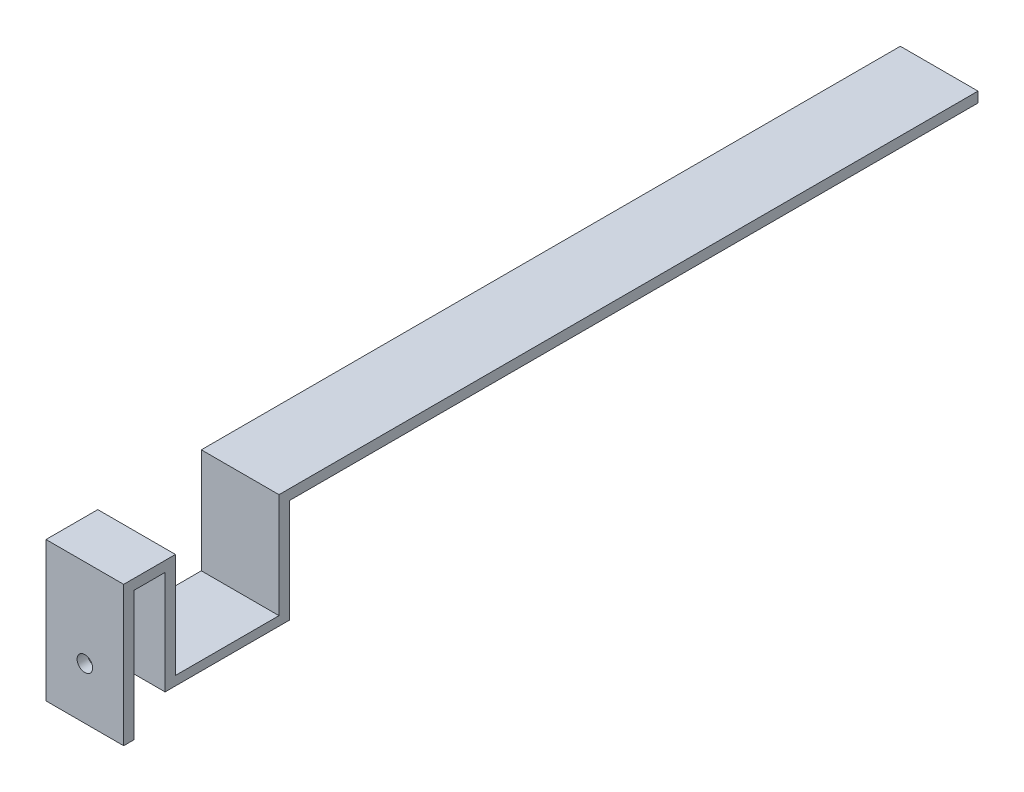
ISO-10303-21;
HEADER;
FILE_DESCRIPTION(('STEP AP214'),'2;1');
FILE_NAME('part.step','',(''),(''),'','','');
FILE_SCHEMA(('AUTOMOTIVE_DESIGN { 1 0 10303 214 1 1 1 1 }'));
ENDSEC;
DATA;
#1=APPLICATION_CONTEXT('core data for automotive mechanical design processes');
#2=APPLICATION_PROTOCOL_DEFINITION('international standard','automotive_design',2000,#1);
#3=PRODUCT_CONTEXT('',#1,'mechanical');
#4=PRODUCT('Part','Part','',(#3));
#5=PRODUCT_RELATED_PRODUCT_CATEGORY('part','',(#4));
#6=PRODUCT_DEFINITION_FORMATION('','',#4);
#7=PRODUCT_DEFINITION_CONTEXT('part definition',#1,'design');
#8=PRODUCT_DEFINITION('design','',#6,#7);
#9=PRODUCT_DEFINITION_SHAPE('','',#8);
#10=(LENGTH_UNIT() NAMED_UNIT(*) SI_UNIT(.MILLI.,.METRE.));
#11=(NAMED_UNIT(*) PLANE_ANGLE_UNIT() SI_UNIT($,.RADIAN.));
#12=(NAMED_UNIT(*) SI_UNIT($,.STERADIAN.) SOLID_ANGLE_UNIT());
#13=UNCERTAINTY_MEASURE_WITH_UNIT(LENGTH_MEASURE(1.E-05),#10,'distance_accuracy_value','');
#14=(GEOMETRIC_REPRESENTATION_CONTEXT(3) GLOBAL_UNCERTAINTY_ASSIGNED_CONTEXT((#13)) GLOBAL_UNIT_ASSIGNED_CONTEXT((#10,
#11,#12)) REPRESENTATION_CONTEXT('',''));
#15=CARTESIAN_POINT('',(0.,0.,0.));
#16=DIRECTION('',(0.,0.,1.));
#17=DIRECTION('',(1.,0.,0.));
#18=AXIS2_PLACEMENT_3D('',#15,#16,#17);
#19=CARTESIAN_POINT('',(15.,0.,0.));
#20=DIRECTION('',(0.,0.,-1.));
#21=DIRECTION('',(0.,1.,0.));
#22=AXIS2_PLACEMENT_3D('',#19,#20,#21);
#23=PLANE('',#22);
#24=CARTESIAN_POINT('',(7.5,10.,0.));
#25=DIRECTION('',(0.,0.,1.));
#26=DIRECTION('',(1.,0.,0.));
#27=AXIS2_PLACEMENT_3D('',#24,#25,#26);
#28=CIRCLE('',#27,1.5);
#29=CARTESIAN_POINT('',(9.,10.,0.));
#30=VERTEX_POINT('',#29);
#31=EDGE_CURVE('E287',#30,#30,#28,.T.);
#32=ORIENTED_EDGE('',*,*,#31,.F.);
#33=EDGE_LOOP('',(#32));
#34=FACE_BOUND('',#33,.T.);
#35=DIRECTION('',(0.,-1.,0.));
#36=VECTOR('',#35,1.);
#37=CARTESIAN_POINT('',(0.,0.,0.));
#38=LINE('',#37,#36);
#39=CARTESIAN_POINT('',(0.,27.,0.));
#40=VERTEX_POINT('',#39);
#41=CARTESIAN_POINT('',(0.,0.,0.));
#42=VERTEX_POINT('',#41);
#43=EDGE_CURVE('E165',#40,#42,#38,.T.);
#44=ORIENTED_EDGE('',*,*,#43,.T.);
#45=DIRECTION('',(-1.,0.,0.));
#46=VECTOR('',#45,1.);
#47=CARTESIAN_POINT('',(15.,0.,0.));
#48=LINE('',#47,#46);
#49=CARTESIAN_POINT('',(15.,0.,0.));
#50=VERTEX_POINT('',#49);
#51=EDGE_CURVE('E11',#50,#42,#48,.T.);
#52=ORIENTED_EDGE('',*,*,#51,.F.);
#53=DIRECTION('',(0.,-1.,0.));
#54=VECTOR('',#53,1.);
#55=CARTESIAN_POINT('',(15.,0.,0.));
#56=LINE('',#55,#54);
#57=CARTESIAN_POINT('',(15.,27.,0.));
#58=VERTEX_POINT('',#57);
#59=EDGE_CURVE('E192',#58,#50,#56,.T.);
#60=ORIENTED_EDGE('',*,*,#59,.F.);
#61=DIRECTION('',(-1.,0.,0.));
#62=VECTOR('',#61,1.);
#63=CARTESIAN_POINT('',(15.,27.,0.));
#64=LINE('',#63,#62);
#65=EDGE_CURVE('E161',#58,#40,#64,.T.);
#66=ORIENTED_EDGE('',*,*,#65,.T.);
#67=EDGE_LOOP('',(#44,#52,#60,#66));
#68=FACE_BOUND('',#67,.T.);
#69=ADVANCED_FACE('F33',(#34,#68),#23,.F.);
#70=CARTESIAN_POINT('',(15.,0.,0.));
#71=DIRECTION('',(0.,1.,0.));
#72=DIRECTION('',(0.,0.,1.));
#73=AXIS2_PLACEMENT_3D('',#70,#71,#72);
#74=PLANE('',#73);
#75=DIRECTION('',(0.,0.,-1.));
#76=VECTOR('',#75,1.);
#77=CARTESIAN_POINT('',(0.,0.,0.));
#78=LINE('',#77,#76);
#79=CARTESIAN_POINT('',(0.,0.,-2.));
#80=VERTEX_POINT('',#79);
#81=EDGE_CURVE('E168',#42,#80,#78,.T.);
#82=ORIENTED_EDGE('',*,*,#81,.T.);
#83=DIRECTION('',(-1.,0.,0.));
#84=VECTOR('',#83,1.);
#85=CARTESIAN_POINT('',(15.,0.,-2.));
#86=LINE('',#85,#84);
#87=CARTESIAN_POINT('',(15.,0.,-2.));
#88=VERTEX_POINT('',#87);
#89=EDGE_CURVE('E41',#88,#80,#86,.T.);
#90=ORIENTED_EDGE('',*,*,#89,.F.);
#91=DIRECTION('',(0.,0.,-1.));
#92=VECTOR('',#91,1.);
#93=CARTESIAN_POINT('',(15.,0.,0.));
#94=LINE('',#93,#92);
#95=EDGE_CURVE('E110',#50,#88,#94,.T.);
#96=ORIENTED_EDGE('',*,*,#95,.F.);
#97=ORIENTED_EDGE('',*,*,#51,.T.);
#98=EDGE_LOOP('',(#82,#90,#96,#97));
#99=FACE_BOUND('',#98,.T.);
#100=ADVANCED_FACE('F280',(#99),#74,.F.);
#101=CARTESIAN_POINT('',(15.,0.,-2.));
#102=DIRECTION('',(0.,0.,1.));
#103=DIRECTION('',(1.,0.,0.));
#104=AXIS2_PLACEMENT_3D('',#101,#102,#103);
#105=PLANE('',#104);
#106=CARTESIAN_POINT('',(7.5,10.,-2.));
#107=DIRECTION('',(0.,0.,1.));
#108=DIRECTION('',(1.,0.,0.));
#109=AXIS2_PLACEMENT_3D('',#106,#107,#108);
#110=CIRCLE('',#109,1.5);
#111=CARTESIAN_POINT('',(9.,10.,-2.));
#112=VERTEX_POINT('',#111);
#113=EDGE_CURVE('E169',#112,#112,#110,.T.);
#114=ORIENTED_EDGE('',*,*,#113,.T.);
#115=EDGE_LOOP('',(#114));
#116=FACE_BOUND('',#115,.T.);
#117=DIRECTION('',(0.,1.,0.));
#118=VECTOR('',#117,1.);
#119=CARTESIAN_POINT('',(0.,0.,-2.));
#120=LINE('',#119,#118);
#121=CARTESIAN_POINT('',(0.,25.,-2.));
#122=VERTEX_POINT('',#121);
#123=EDGE_CURVE('E171',#80,#122,#120,.T.);
#124=ORIENTED_EDGE('',*,*,#123,.T.);
#125=DIRECTION('',(-1.,0.,0.));
#126=VECTOR('',#125,1.);
#127=CARTESIAN_POINT('',(15.,25.,-2.));
#128=LINE('',#127,#126);
#129=CARTESIAN_POINT('',(15.,25.,-2.));
#130=VERTEX_POINT('',#129);
#131=EDGE_CURVE('E217',#130,#122,#128,.T.);
#132=ORIENTED_EDGE('',*,*,#131,.F.);
#133=DIRECTION('',(0.,1.,0.));
#134=VECTOR('',#133,1.);
#135=CARTESIAN_POINT('',(15.,0.,-2.));
#136=LINE('',#135,#134);
#137=EDGE_CURVE('E225',#88,#130,#136,.T.);
#138=ORIENTED_EDGE('',*,*,#137,.F.);
#139=ORIENTED_EDGE('',*,*,#89,.T.);
#140=EDGE_LOOP('',(#124,#132,#138,#139));
#141=FACE_BOUND('',#140,.T.);
#142=ADVANCED_FACE('F223',(#116,#141),#105,.F.);
#143=CARTESIAN_POINT('',(15.,25.,-2.));
#144=DIRECTION('',(0.,1.,0.));
#145=DIRECTION('',(0.,0.,1.));
#146=AXIS2_PLACEMENT_3D('',#143,#144,#145);
#147=PLANE('',#146);
#148=DIRECTION('',(0.,0.,-1.));
#149=VECTOR('',#148,1.);
#150=CARTESIAN_POINT('',(0.,25.,-2.));
#151=LINE('',#150,#149);
#152=CARTESIAN_POINT('',(0.,25.,-8.));
#153=VERTEX_POINT('',#152);
#154=EDGE_CURVE('E173',#122,#153,#151,.T.);
#155=ORIENTED_EDGE('',*,*,#154,.T.);
#156=DIRECTION('',(-1.,0.,0.));
#157=VECTOR('',#156,1.);
#158=CARTESIAN_POINT('',(15.,25.,-8.));
#159=LINE('',#158,#157);
#160=CARTESIAN_POINT('',(15.,25.,-8.));
#161=VERTEX_POINT('',#160);
#162=EDGE_CURVE('E214',#161,#153,#159,.T.);
#163=ORIENTED_EDGE('',*,*,#162,.F.);
#164=DIRECTION('',(0.,0.,-1.));
#165=VECTOR('',#164,1.);
#166=CARTESIAN_POINT('',(15.,25.,-2.));
#167=LINE('',#166,#165);
#168=EDGE_CURVE('E243',#130,#161,#167,.T.);
#169=ORIENTED_EDGE('',*,*,#168,.F.);
#170=ORIENTED_EDGE('',*,*,#131,.T.);
#171=EDGE_LOOP('',(#155,#163,#169,#170));
#172=FACE_BOUND('',#171,.T.);
#173=ADVANCED_FACE('F234',(#172),#147,.F.);
#174=CARTESIAN_POINT('',(15.,25.,-8.));
#175=DIRECTION('',(0.,0.,-1.));
#176=DIRECTION('',(-1.,0.,0.));
#177=AXIS2_PLACEMENT_3D('',#174,#175,#176);
#178=PLANE('',#177);
#179=DIRECTION('',(0.,-1.,0.));
#180=VECTOR('',#179,1.);
#181=CARTESIAN_POINT('',(0.,25.,-8.));
#182=LINE('',#181,#180);
#183=CARTESIAN_POINT('',(0.,5.,-8.));
#184=VERTEX_POINT('',#183);
#185=EDGE_CURVE('E175',#153,#184,#182,.T.);
#186=ORIENTED_EDGE('',*,*,#185,.T.);
#187=DIRECTION('',(-1.,0.,0.));
#188=VECTOR('',#187,1.);
#189=CARTESIAN_POINT('',(15.,5.,-8.));
#190=LINE('',#189,#188);
#191=CARTESIAN_POINT('',(15.,5.,-8.));
#192=VERTEX_POINT('',#191);
#193=EDGE_CURVE('E211',#192,#184,#190,.T.);
#194=ORIENTED_EDGE('',*,*,#193,.F.);
#195=DIRECTION('',(0.,-1.,0.));
#196=VECTOR('',#195,1.);
#197=CARTESIAN_POINT('',(15.,25.,-8.));
#198=LINE('',#197,#196);
#199=EDGE_CURVE('E240',#161,#192,#198,.T.);
#200=ORIENTED_EDGE('',*,*,#199,.F.);
#201=ORIENTED_EDGE('',*,*,#162,.T.);
#202=EDGE_LOOP('',(#186,#194,#200,#201));
#203=FACE_BOUND('',#202,.T.);
#204=ADVANCED_FACE('F238',(#203),#178,.F.);
#205=CARTESIAN_POINT('',(15.,5.,-8.));
#206=DIRECTION('',(0.,1.,0.));
#207=DIRECTION('',(0.,0.,1.));
#208=AXIS2_PLACEMENT_3D('',#205,#206,#207);
#209=PLANE('',#208);
#210=DIRECTION('',(0.,0.,-1.));
#211=VECTOR('',#210,1.);
#212=CARTESIAN_POINT('',(0.,5.,-8.));
#213=LINE('',#212,#211);
#214=CARTESIAN_POINT('',(0.,5.,-32.));
#215=VERTEX_POINT('',#214);
#216=EDGE_CURVE('E177',#184,#215,#213,.T.);
#217=ORIENTED_EDGE('',*,*,#216,.T.);
#218=DIRECTION('',(-1.,0.,0.));
#219=VECTOR('',#218,1.);
#220=CARTESIAN_POINT('',(15.,5.,-32.));
#221=LINE('',#220,#219);
#222=CARTESIAN_POINT('',(15.,5.,-32.));
#223=VERTEX_POINT('',#222);
#224=EDGE_CURVE('E208',#223,#215,#221,.T.);
#225=ORIENTED_EDGE('',*,*,#224,.F.);
#226=DIRECTION('',(0.,0.,-1.));
#227=VECTOR('',#226,1.);
#228=CARTESIAN_POINT('',(15.,5.,-8.));
#229=LINE('',#228,#227);
#230=EDGE_CURVE('E242',#192,#223,#229,.T.);
#231=ORIENTED_EDGE('',*,*,#230,.F.);
#232=ORIENTED_EDGE('',*,*,#193,.T.);
#233=EDGE_LOOP('',(#217,#225,#231,#232));
#234=FACE_BOUND('',#233,.T.);
#235=ADVANCED_FACE('F373',(#234),#209,.F.);
#236=CARTESIAN_POINT('',(15.,5.,-32.));
#237=DIRECTION('',(0.,0.,1.));
#238=DIRECTION('',(1.,0.,0.));
#239=AXIS2_PLACEMENT_3D('',#236,#237,#238);
#240=PLANE('',#239);
#241=DIRECTION('',(0.,1.,0.));
#242=VECTOR('',#241,1.);
#243=CARTESIAN_POINT('',(0.,5.,-32.));
#244=LINE('',#243,#242);
#245=CARTESIAN_POINT('',(0.,25.,-32.));
#246=VERTEX_POINT('',#245);
#247=EDGE_CURVE('E179',#215,#246,#244,.T.);
#248=ORIENTED_EDGE('',*,*,#247,.T.);
#249=DIRECTION('',(-1.,0.,0.));
#250=VECTOR('',#249,1.);
#251=CARTESIAN_POINT('',(15.,25.,-32.));
#252=LINE('',#251,#250);
#253=CARTESIAN_POINT('',(15.,25.,-32.));
#254=VERTEX_POINT('',#253);
#255=EDGE_CURVE('E205',#254,#246,#252,.T.);
#256=ORIENTED_EDGE('',*,*,#255,.F.);
#257=DIRECTION('',(0.,1.,0.));
#258=VECTOR('',#257,1.);
#259=CARTESIAN_POINT('',(15.,5.,-32.));
#260=LINE('',#259,#258);
#261=EDGE_CURVE('E245',#223,#254,#260,.T.);
#262=ORIENTED_EDGE('',*,*,#261,.F.);
#263=ORIENTED_EDGE('',*,*,#224,.T.);
#264=EDGE_LOOP('',(#248,#256,#262,#263));
#265=FACE_BOUND('',#264,.T.);
#266=ADVANCED_FACE('F363',(#265),#240,.F.);
#267=CARTESIAN_POINT('',(15.,25.,-32.));
#268=DIRECTION('',(0.,1.,0.));
#269=DIRECTION('',(0.,0.,1.));
#270=AXIS2_PLACEMENT_3D('',#267,#268,#269);
#271=PLANE('',#270);
#272=DIRECTION('',(0.,0.,-1.));
#273=VECTOR('',#272,1.);
#274=CARTESIAN_POINT('',(0.,25.,-32.));
#275=LINE('',#274,#273);
#276=CARTESIAN_POINT('',(0.,25.,-165.));
#277=VERTEX_POINT('',#276);
#278=EDGE_CURVE('E181',#246,#277,#275,.T.);
#279=ORIENTED_EDGE('',*,*,#278,.T.);
#280=DIRECTION('',(-1.,0.,0.));
#281=VECTOR('',#280,1.);
#282=CARTESIAN_POINT('',(15.,25.,-165.));
#283=LINE('',#282,#281);
#284=CARTESIAN_POINT('',(15.,25.,-165.));
#285=VERTEX_POINT('',#284);
#286=EDGE_CURVE('E202',#285,#277,#283,.T.);
#287=ORIENTED_EDGE('',*,*,#286,.F.);
#288=DIRECTION('',(0.,0.,-1.));
#289=VECTOR('',#288,1.);
#290=CARTESIAN_POINT('',(15.,25.,-32.));
#291=LINE('',#290,#289);
#292=EDGE_CURVE('E251',#254,#285,#291,.T.);
#293=ORIENTED_EDGE('',*,*,#292,.F.);
#294=ORIENTED_EDGE('',*,*,#255,.T.);
#295=EDGE_LOOP('',(#279,#287,#293,#294));
#296=FACE_BOUND('',#295,.T.);
#297=ADVANCED_FACE('F353',(#296),#271,.F.);
#298=CARTESIAN_POINT('',(15.,27.,-165.));
#299=DIRECTION('',(0.,0.,1.));
#300=DIRECTION('',(1.,0.,0.));
#301=AXIS2_PLACEMENT_3D('',#298,#299,#300);
#302=PLANE('',#301);
#303=DIRECTION('',(0.,1.,0.));
#304=VECTOR('',#303,1.);
#305=CARTESIAN_POINT('',(0.,27.,-165.));
#306=LINE('',#305,#304);
#307=CARTESIAN_POINT('',(0.,27.,-165.));
#308=VERTEX_POINT('',#307);
#309=EDGE_CURVE('E183',#277,#308,#306,.T.);
#310=ORIENTED_EDGE('',*,*,#309,.T.);
#311=DIRECTION('',(-1.,0.,0.));
#312=VECTOR('',#311,1.);
#313=CARTESIAN_POINT('',(15.,27.,-165.));
#314=LINE('',#313,#312);
#315=CARTESIAN_POINT('',(15.,27.,-165.));
#316=VERTEX_POINT('',#315);
#317=EDGE_CURVE('E199',#316,#308,#314,.T.);
#318=ORIENTED_EDGE('',*,*,#317,.F.);
#319=DIRECTION('',(0.,1.,0.));
#320=VECTOR('',#319,1.);
#321=CARTESIAN_POINT('',(15.,27.,-165.));
#322=LINE('',#321,#320);
#323=EDGE_CURVE('E253',#285,#316,#322,.T.);
#324=ORIENTED_EDGE('',*,*,#323,.F.);
#325=ORIENTED_EDGE('',*,*,#286,.T.);
#326=EDGE_LOOP('',(#310,#318,#324,#325));
#327=FACE_BOUND('',#326,.T.);
#328=ADVANCED_FACE('F344',(#327),#302,.F.);
#329=CARTESIAN_POINT('',(15.,27.,-30.));
#330=DIRECTION('',(0.,-1.,0.));
#331=DIRECTION('',(0.,0.,-1.));
#332=AXIS2_PLACEMENT_3D('',#329,#330,#331);
#333=PLANE('',#332);
#334=DIRECTION('',(0.,0.,1.));
#335=VECTOR('',#334,1.);
#336=CARTESIAN_POINT('',(0.,27.,-30.));
#337=LINE('',#336,#335);
#338=CARTESIAN_POINT('',(0.,27.,-30.));
#339=VERTEX_POINT('',#338);
#340=EDGE_CURVE('E185',#308,#339,#337,.T.);
#341=ORIENTED_EDGE('',*,*,#340,.T.);
#342=DIRECTION('',(-1.,0.,0.));
#343=VECTOR('',#342,1.);
#344=CARTESIAN_POINT('',(15.,27.,-30.));
#345=LINE('',#344,#343);
#346=CARTESIAN_POINT('',(15.,27.,-30.));
#347=VERTEX_POINT('',#346);
#348=EDGE_CURVE('E196',#347,#339,#345,.T.);
#349=ORIENTED_EDGE('',*,*,#348,.F.);
#350=DIRECTION('',(0.,0.,1.));
#351=VECTOR('',#350,1.);
#352=CARTESIAN_POINT('',(15.,27.,-30.));
#353=LINE('',#352,#351);
#354=EDGE_CURVE('E255',#316,#347,#353,.T.);
#355=ORIENTED_EDGE('',*,*,#354,.F.);
#356=ORIENTED_EDGE('',*,*,#317,.T.);
#357=EDGE_LOOP('',(#341,#349,#355,#356));
#358=FACE_BOUND('',#357,.T.);
#359=ADVANCED_FACE('F261',(#358),#333,.F.);
#360=CARTESIAN_POINT('',(15.,6.76083305723556,-30.));
#361=DIRECTION('',(0.,0.,-1.));
#362=DIRECTION('',(-1.,0.,0.));
#363=AXIS2_PLACEMENT_3D('',#360,#361,#362);
#364=PLANE('',#363);
#365=DIRECTION('',(0.,-1.,0.));
#366=VECTOR('',#365,1.);
#367=CARTESIAN_POINT('',(0.,6.76083305723556,-30.));
#368=LINE('',#367,#366);
#369=CARTESIAN_POINT('',(0.,6.76083305723556,-30.));
#370=VERTEX_POINT('',#369);
#371=EDGE_CURVE('E187',#339,#370,#368,.T.);
#372=ORIENTED_EDGE('',*,*,#371,.T.);
#373=DIRECTION('',(-1.,0.,0.));
#374=VECTOR('',#373,1.);
#375=CARTESIAN_POINT('',(15.,6.76083305723556,-30.));
#376=LINE('',#375,#374);
#377=CARTESIAN_POINT('',(15.,6.76083305723556,-30.));
#378=VERTEX_POINT('',#377);
#379=EDGE_CURVE('E156',#378,#370,#376,.T.);
#380=ORIENTED_EDGE('',*,*,#379,.F.);
#381=DIRECTION('',(0.,-1.,0.));
#382=VECTOR('',#381,1.);
#383=CARTESIAN_POINT('',(15.,6.76083305723556,-30.));
#384=LINE('',#383,#382);
#385=EDGE_CURVE('E147',#347,#378,#384,.T.);
#386=ORIENTED_EDGE('',*,*,#385,.F.);
#387=ORIENTED_EDGE('',*,*,#348,.T.);
#388=EDGE_LOOP('',(#372,#380,#386,#387));
#389=FACE_BOUND('',#388,.T.);
#390=ADVANCED_FACE('F265',(#389),#364,.F.);
#391=CARTESIAN_POINT('',(15.,6.76083305723556,-10.));
#392=DIRECTION('',(0.,-1.,0.));
#393=DIRECTION('',(0.,0.,-1.));
#394=AXIS2_PLACEMENT_3D('',#391,#392,#393);
#395=PLANE('',#394);
#396=DIRECTION('',(0.,0.,1.));
#397=VECTOR('',#396,1.);
#398=CARTESIAN_POINT('',(0.,6.76083305723556,-10.));
#399=LINE('',#398,#397);
#400=CARTESIAN_POINT('',(0.,6.76083305723556,-10.));
#401=VERTEX_POINT('',#400);
#402=EDGE_CURVE('E155',#370,#401,#399,.T.);
#403=ORIENTED_EDGE('',*,*,#402,.T.);
#404=DIRECTION('',(-1.,0.,0.));
#405=VECTOR('',#404,1.);
#406=CARTESIAN_POINT('',(15.,6.76083305723556,-10.));
#407=LINE('',#406,#405);
#408=CARTESIAN_POINT('',(15.,6.76083305723556,-10.));
#409=VERTEX_POINT('',#408);
#410=EDGE_CURVE('E152',#409,#401,#407,.T.);
#411=ORIENTED_EDGE('',*,*,#410,.F.);
#412=DIRECTION('',(0.,0.,1.));
#413=VECTOR('',#412,1.);
#414=CARTESIAN_POINT('',(15.,6.76083305723556,-10.));
#415=LINE('',#414,#413);
#416=EDGE_CURVE('E141',#378,#409,#415,.T.);
#417=ORIENTED_EDGE('',*,*,#416,.F.);
#418=ORIENTED_EDGE('',*,*,#379,.T.);
#419=EDGE_LOOP('',(#403,#411,#417,#418));
#420=FACE_BOUND('',#419,.T.);
#421=ADVANCED_FACE('F153',(#420),#395,.F.);
#422=CARTESIAN_POINT('',(15.,27.,-10.));
#423=DIRECTION('',(0.,0.,1.));
#424=DIRECTION('',(0.,-1.,0.));
#425=AXIS2_PLACEMENT_3D('',#422,#423,#424);
#426=PLANE('',#425);
#427=DIRECTION('',(0.,1.,0.));
#428=VECTOR('',#427,1.);
#429=CARTESIAN_POINT('',(0.,27.,-10.));
#430=LINE('',#429,#428);
#431=CARTESIAN_POINT('',(0.,27.,-10.));
#432=VERTEX_POINT('',#431);
#433=EDGE_CURVE('E96',#401,#432,#430,.T.);
#434=ORIENTED_EDGE('',*,*,#433,.T.);
#435=DIRECTION('',(-1.,0.,0.));
#436=VECTOR('',#435,1.);
#437=CARTESIAN_POINT('',(15.,27.,-10.));
#438=LINE('',#437,#436);
#439=CARTESIAN_POINT('',(15.,27.,-10.));
#440=VERTEX_POINT('',#439);
#441=EDGE_CURVE('E157',#440,#432,#438,.T.);
#442=ORIENTED_EDGE('',*,*,#441,.F.);
#443=DIRECTION('',(0.,1.,0.));
#444=VECTOR('',#443,1.);
#445=CARTESIAN_POINT('',(15.,27.,-10.));
#446=LINE('',#445,#444);
#447=EDGE_CURVE('E145',#409,#440,#446,.T.);
#448=ORIENTED_EDGE('',*,*,#447,.F.);
#449=ORIENTED_EDGE('',*,*,#410,.T.);
#450=EDGE_LOOP('',(#434,#442,#448,#449));
#451=FACE_BOUND('',#450,.T.);
#452=ADVANCED_FACE('F159',(#451),#426,.F.);
#453=CARTESIAN_POINT('',(15.,27.,0.));
#454=DIRECTION('',(0.,-1.,0.));
#455=DIRECTION('',(0.,0.,-1.));
#456=AXIS2_PLACEMENT_3D('',#453,#454,#455);
#457=PLANE('',#456);
#458=DIRECTION('',(0.,0.,1.));
#459=VECTOR('',#458,1.);
#460=CARTESIAN_POINT('',(0.,27.,0.));
#461=LINE('',#460,#459);
#462=EDGE_CURVE('E102',#432,#40,#461,.T.);
#463=ORIENTED_EDGE('',*,*,#462,.T.);
#464=ORIENTED_EDGE('',*,*,#65,.F.);
#465=DIRECTION('',(0.,0.,1.));
#466=VECTOR('',#465,1.);
#467=CARTESIAN_POINT('',(15.,27.,0.));
#468=LINE('',#467,#466);
#469=EDGE_CURVE('E49',#440,#58,#468,.T.);
#470=ORIENTED_EDGE('',*,*,#469,.F.);
#471=ORIENTED_EDGE('',*,*,#441,.T.);
#472=EDGE_LOOP('',(#463,#464,#470,#471));
#473=FACE_BOUND('',#472,.T.);
#474=ADVANCED_FACE('F269',(#473),#457,.F.);
#475=CARTESIAN_POINT('',(15.,0.,0.));
#476=DIRECTION('',(-1.,0.,0.));
#477=DIRECTION('',(0.,0.,1.));
#478=AXIS2_PLACEMENT_3D('',#475,#476,#477);
#479=PLANE('',#478);
#480=ORIENTED_EDGE('',*,*,#59,.T.);
#481=ORIENTED_EDGE('',*,*,#95,.T.);
#482=ORIENTED_EDGE('',*,*,#137,.T.);
#483=ORIENTED_EDGE('',*,*,#168,.T.);
#484=ORIENTED_EDGE('',*,*,#199,.T.);
#485=ORIENTED_EDGE('',*,*,#230,.T.);
#486=ORIENTED_EDGE('',*,*,#261,.T.);
#487=ORIENTED_EDGE('',*,*,#292,.T.);
#488=ORIENTED_EDGE('',*,*,#323,.T.);
#489=ORIENTED_EDGE('',*,*,#354,.T.);
#490=ORIENTED_EDGE('',*,*,#385,.T.);
#491=ORIENTED_EDGE('',*,*,#416,.T.);
#492=ORIENTED_EDGE('',*,*,#447,.T.);
#493=ORIENTED_EDGE('',*,*,#469,.T.);
#494=EDGE_LOOP('',(#480,#481,#482,#483,#484,#485,#486,#487,#488,#489,#490,#491,#492,#493));
#495=FACE_BOUND('',#494,.T.);
#496=ADVANCED_FACE('F143',(#495),#479,.F.);
#497=CARTESIAN_POINT('',(0.,0.,0.));
#498=DIRECTION('',(-1.,0.,0.));
#499=DIRECTION('',(0.,0.,1.));
#500=AXIS2_PLACEMENT_3D('',#497,#498,#499);
#501=PLANE('',#500);
#502=ORIENTED_EDGE('',*,*,#43,.F.);
#503=ORIENTED_EDGE('',*,*,#462,.F.);
#504=ORIENTED_EDGE('',*,*,#433,.F.);
#505=ORIENTED_EDGE('',*,*,#402,.F.);
#506=ORIENTED_EDGE('',*,*,#371,.F.);
#507=ORIENTED_EDGE('',*,*,#340,.F.);
#508=ORIENTED_EDGE('',*,*,#309,.F.);
#509=ORIENTED_EDGE('',*,*,#278,.F.);
#510=ORIENTED_EDGE('',*,*,#247,.F.);
#511=ORIENTED_EDGE('',*,*,#216,.F.);
#512=ORIENTED_EDGE('',*,*,#185,.F.);
#513=ORIENTED_EDGE('',*,*,#154,.F.);
#514=ORIENTED_EDGE('',*,*,#123,.F.);
#515=ORIENTED_EDGE('',*,*,#81,.F.);
#516=EDGE_LOOP('',(#502,#503,#504,#505,#506,#507,#508,#509,#510,#511,#512,#513,#514,#515));
#517=FACE_BOUND('',#516,.T.);
#518=ADVANCED_FACE('F229',(#517),#501,.T.);
#519=CARTESIAN_POINT('',(7.5,10.,-2.));
#520=DIRECTION('',(0.,0.,1.));
#521=DIRECTION('',(1.,0.,0.));
#522=AXIS2_PLACEMENT_3D('',#519,#520,#521);
#523=CYLINDRICAL_SURFACE('',#522,1.5);
#524=ORIENTED_EDGE('',*,*,#113,.F.);
#525=EDGE_LOOP('',(#524));
#526=FACE_BOUND('',#525,.T.);
#527=ORIENTED_EDGE('',*,*,#31,.T.);
#528=EDGE_LOOP('',(#527));
#529=FACE_BOUND('',#528,.T.);
#530=ADVANCED_FACE('F297',(#526,#529),#523,.F.);
#531=CLOSED_SHELL('',(#69,#100,#142,#173,#204,#235,#266,#297,#328,#359,#390,#421,#452,#474,#496,
#518,#530));
#532=MANIFOLD_SOLID_BREP('B2',#531);
#533=ADVANCED_BREP_SHAPE_REPRESENTATION('',(#18,#532),#14);
#534=SHAPE_DEFINITION_REPRESENTATION(#9,#533);
ENDSEC;
END-ISO-10303-21;
